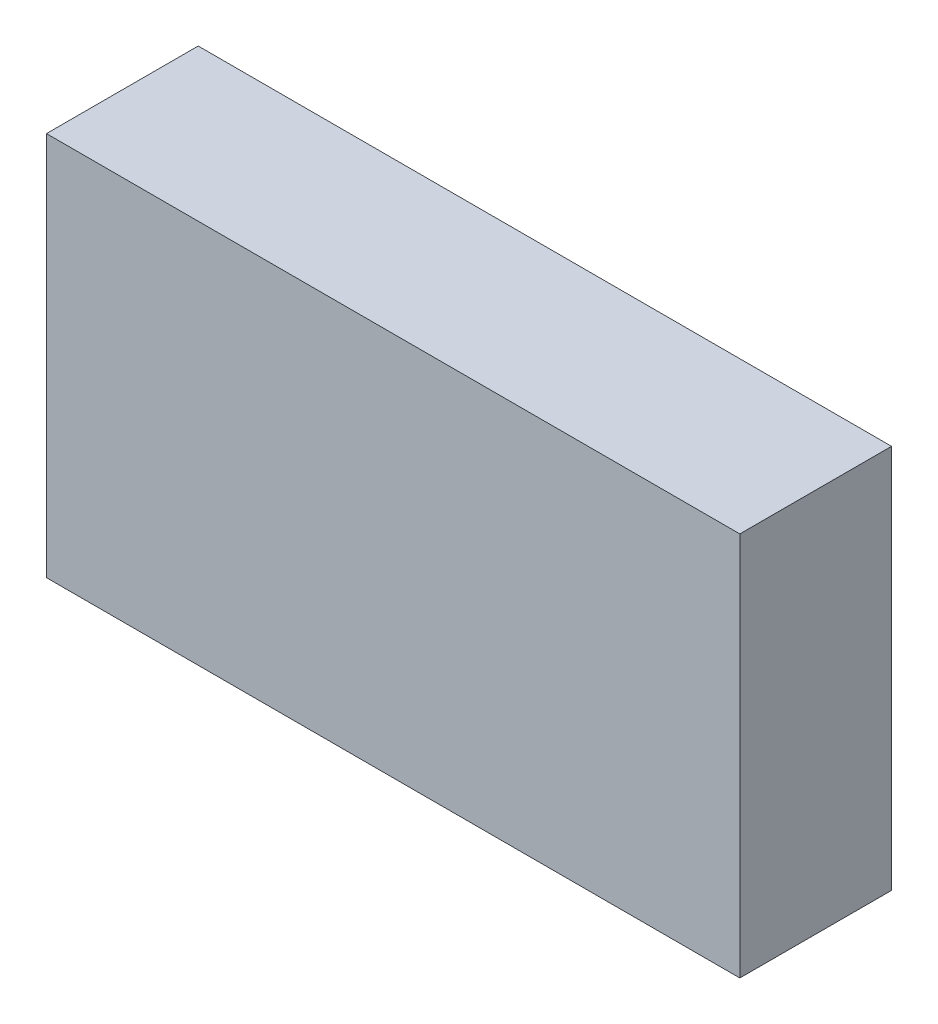
ISO-10303-21;
HEADER;
FILE_DESCRIPTION(('STEP AP214'),'2;1');
FILE_NAME('part.step','',(''),(''),'','','');
FILE_SCHEMA(('AUTOMOTIVE_DESIGN { 1 0 10303 214 1 1 1 1 }'));
ENDSEC;
DATA;
#1=APPLICATION_CONTEXT('core data for automotive mechanical design processes');
#2=APPLICATION_PROTOCOL_DEFINITION('international standard','automotive_design',2000,#1);
#3=PRODUCT_CONTEXT('',#1,'mechanical');
#4=PRODUCT('Part','Part','',(#3));
#5=PRODUCT_RELATED_PRODUCT_CATEGORY('part','',(#4));
#6=PRODUCT_DEFINITION_FORMATION('','',#4);
#7=PRODUCT_DEFINITION_CONTEXT('part definition',#1,'design');
#8=PRODUCT_DEFINITION('design','',#6,#7);
#9=PRODUCT_DEFINITION_SHAPE('','',#8);
#10=(LENGTH_UNIT() NAMED_UNIT(*) SI_UNIT(.MILLI.,.METRE.));
#11=(NAMED_UNIT(*) PLANE_ANGLE_UNIT() SI_UNIT($,.RADIAN.));
#12=(NAMED_UNIT(*) SI_UNIT($,.STERADIAN.) SOLID_ANGLE_UNIT());
#13=UNCERTAINTY_MEASURE_WITH_UNIT(LENGTH_MEASURE(1.E-05),#10,'distance_accuracy_value','');
#14=(GEOMETRIC_REPRESENTATION_CONTEXT(3) GLOBAL_UNCERTAINTY_ASSIGNED_CONTEXT((#13)) GLOBAL_UNIT_ASSIGNED_CONTEXT((#10,
#11,#12)) REPRESENTATION_CONTEXT('',''));
#15=CARTESIAN_POINT('',(0.,0.,0.));
#16=DIRECTION('',(0.,0.,1.));
#17=DIRECTION('',(1.,0.,0.));
#18=AXIS2_PLACEMENT_3D('',#15,#16,#17);
#19=CARTESIAN_POINT('',(0.,0.,0.));
#20=DIRECTION('',(0.,0.,1.));
#21=DIRECTION('',(1.,0.,0.));
#22=AXIS2_PLACEMENT_3D('',#19,#20,#21);
#23=PLANE('',#22);
#24=DIRECTION('',(0.,1.,0.));
#25=VECTOR('',#24,1.);
#26=CARTESIAN_POINT('',(-2.285,1.2675,0.));
#27=LINE('',#26,#25);
#28=CARTESIAN_POINT('',(-2.285,1.2675,0.));
#29=VERTEX_POINT('',#28);
#30=CARTESIAN_POINT('',(-2.285,-1.2675,0.));
#31=VERTEX_POINT('',#30);
#32=EDGE_CURVE('E79',#29,#31,#27,.F.);
#33=ORIENTED_EDGE('',*,*,#32,.F.);
#34=DIRECTION('',(1.,0.,0.));
#35=VECTOR('',#34,1.);
#36=CARTESIAN_POINT('',(2.285,1.2675,0.));
#37=LINE('',#36,#35);
#38=CARTESIAN_POINT('',(2.285,1.2675,0.));
#39=VERTEX_POINT('',#38);
#40=EDGE_CURVE('E55',#39,#29,#37,.F.);
#41=ORIENTED_EDGE('',*,*,#40,.F.);
#42=DIRECTION('',(0.,1.,0.));
#43=VECTOR('',#42,1.);
#44=CARTESIAN_POINT('',(2.285,-1.2675,0.));
#45=LINE('',#44,#43);
#46=CARTESIAN_POINT('',(2.285,-1.2675,0.));
#47=VERTEX_POINT('',#46);
#48=EDGE_CURVE('E57',#47,#39,#45,.T.);
#49=ORIENTED_EDGE('',*,*,#48,.F.);
#50=DIRECTION('',(1.,0.,0.));
#51=VECTOR('',#50,1.);
#52=CARTESIAN_POINT('',(-2.285,-1.2675,0.));
#53=LINE('',#52,#51);
#54=EDGE_CURVE('E20',#31,#47,#53,.T.);
#55=ORIENTED_EDGE('',*,*,#54,.F.);
#56=EDGE_LOOP('',(#33,#41,#49,#55));
#57=FACE_BOUND('',#56,.T.);
#58=ADVANCED_FACE('F17',(#57),#23,.F.);
#59=CARTESIAN_POINT('',(-2.285,-1.2675,0.));
#60=DIRECTION('',(0.,-1.,0.));
#61=DIRECTION('',(0.,0.,-1.));
#62=AXIS2_PLACEMENT_3D('',#59,#60,#61);
#63=PLANE('',#62);
#64=DIRECTION('',(1.,0.,0.));
#65=VECTOR('',#64,1.);
#66=CARTESIAN_POINT('',(0.,-1.2675,1.));
#67=LINE('',#66,#65);
#68=CARTESIAN_POINT('',(-2.285,-1.2675,1.));
#69=VERTEX_POINT('',#68);
#70=CARTESIAN_POINT('',(2.285,-1.2675,1.));
#71=VERTEX_POINT('',#70);
#72=EDGE_CURVE('E83',#69,#71,#67,.T.);
#73=ORIENTED_EDGE('',*,*,#72,.F.);
#74=DIRECTION('',(0.,0.,1.));
#75=VECTOR('',#74,1.);
#76=CARTESIAN_POINT('',(-2.285,-1.2675,0.));
#77=LINE('',#76,#75);
#78=EDGE_CURVE('E68',#31,#69,#77,.T.);
#79=ORIENTED_EDGE('',*,*,#78,.F.);
#80=ORIENTED_EDGE('',*,*,#54,.T.);
#81=DIRECTION('',(0.,0.,-1.));
#82=VECTOR('',#81,1.);
#83=CARTESIAN_POINT('',(2.285,-1.2675,0.));
#84=LINE('',#83,#82);
#85=EDGE_CURVE('E63',#71,#47,#84,.T.);
#86=ORIENTED_EDGE('',*,*,#85,.F.);
#87=EDGE_LOOP('',(#73,#79,#80,#86));
#88=FACE_BOUND('',#87,.T.);
#89=ADVANCED_FACE('F65',(#88),#63,.T.);
#90=CARTESIAN_POINT('',(2.285,-1.2675,0.));
#91=DIRECTION('',(1.,0.,0.));
#92=DIRECTION('',(0.,0.,-1.));
#93=AXIS2_PLACEMENT_3D('',#90,#91,#92);
#94=PLANE('',#93);
#95=DIRECTION('',(0.,1.,0.));
#96=VECTOR('',#95,1.);
#97=CARTESIAN_POINT('',(2.285,0.,1.));
#98=LINE('',#97,#96);
#99=CARTESIAN_POINT('',(2.285,1.2675,1.));
#100=VERTEX_POINT('',#99);
#101=EDGE_CURVE('E72',#71,#100,#98,.T.);
#102=ORIENTED_EDGE('',*,*,#101,.F.);
#103=ORIENTED_EDGE('',*,*,#85,.T.);
#104=ORIENTED_EDGE('',*,*,#48,.T.);
#105=DIRECTION('',(0.,0.,1.));
#106=VECTOR('',#105,1.);
#107=CARTESIAN_POINT('',(2.285,1.2675,0.));
#108=LINE('',#107,#106);
#109=EDGE_CURVE('E75',#100,#39,#108,.F.);
#110=ORIENTED_EDGE('',*,*,#109,.F.);
#111=EDGE_LOOP('',(#102,#103,#104,#110));
#112=FACE_BOUND('',#111,.T.);
#113=ADVANCED_FACE('F70',(#112),#94,.T.);
#114=CARTESIAN_POINT('',(2.285,1.2675,0.));
#115=DIRECTION('',(0.,1.,0.));
#116=DIRECTION('',(0.,0.,1.));
#117=AXIS2_PLACEMENT_3D('',#114,#115,#116);
#118=PLANE('',#117);
#119=DIRECTION('',(1.,0.,0.));
#120=VECTOR('',#119,1.);
#121=CARTESIAN_POINT('',(0.,1.2675,1.));
#122=LINE('',#121,#120);
#123=CARTESIAN_POINT('',(-2.285,1.2675,1.));
#124=VERTEX_POINT('',#123);
#125=EDGE_CURVE('E26',#100,#124,#122,.F.);
#126=ORIENTED_EDGE('',*,*,#125,.F.);
#127=ORIENTED_EDGE('',*,*,#109,.T.);
#128=ORIENTED_EDGE('',*,*,#40,.T.);
#129=DIRECTION('',(0.,0.,1.));
#130=VECTOR('',#129,1.);
#131=CARTESIAN_POINT('',(-2.285,1.2675,0.));
#132=LINE('',#131,#130);
#133=EDGE_CURVE('E35',#124,#29,#132,.F.);
#134=ORIENTED_EDGE('',*,*,#133,.F.);
#135=EDGE_LOOP('',(#126,#127,#128,#134));
#136=FACE_BOUND('',#135,.T.);
#137=ADVANCED_FACE('F89',(#136),#118,.T.);
#138=CARTESIAN_POINT('',(-2.285,1.2675,0.));
#139=DIRECTION('',(-1.,0.,0.));
#140=DIRECTION('',(0.,0.,1.));
#141=AXIS2_PLACEMENT_3D('',#138,#139,#140);
#142=PLANE('',#141);
#143=DIRECTION('',(0.,1.,0.));
#144=VECTOR('',#143,1.);
#145=CARTESIAN_POINT('',(-2.285,0.,1.));
#146=LINE('',#145,#144);
#147=EDGE_CURVE('E11',#124,#69,#146,.F.);
#148=ORIENTED_EDGE('',*,*,#147,.F.);
#149=ORIENTED_EDGE('',*,*,#133,.T.);
#150=ORIENTED_EDGE('',*,*,#32,.T.);
#151=ORIENTED_EDGE('',*,*,#78,.T.);
#152=EDGE_LOOP('',(#148,#149,#150,#151));
#153=FACE_BOUND('',#152,.T.);
#154=ADVANCED_FACE('F91',(#153),#142,.T.);
#155=CARTESIAN_POINT('',(0.,0.,1.));
#156=DIRECTION('',(0.,0.,1.));
#157=DIRECTION('',(1.,0.,0.));
#158=AXIS2_PLACEMENT_3D('',#155,#156,#157);
#159=PLANE('',#158);
#160=ORIENTED_EDGE('',*,*,#125,.T.);
#161=ORIENTED_EDGE('',*,*,#147,.T.);
#162=ORIENTED_EDGE('',*,*,#72,.T.);
#163=ORIENTED_EDGE('',*,*,#101,.T.);
#164=EDGE_LOOP('',(#160,#161,#162,#163));
#165=FACE_BOUND('',#164,.T.);
#166=ADVANCED_FACE('F88',(#165),#159,.T.);
#167=CLOSED_SHELL('',(#58,#89,#113,#137,#154,#166));
#168=MANIFOLD_SOLID_BREP('B1',#167);
#169=ADVANCED_BREP_SHAPE_REPRESENTATION('',(#18,#168),#14);
#170=SHAPE_DEFINITION_REPRESENTATION(#9,#169);
ENDSEC;
END-ISO-10303-21;
